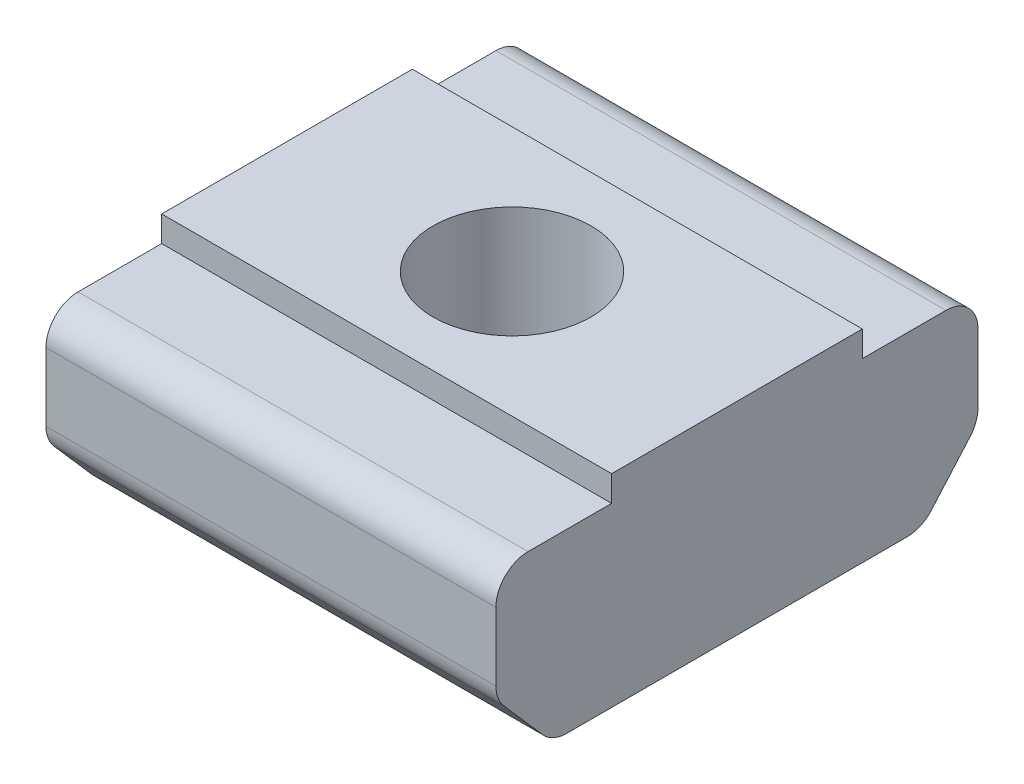
ISO-10303-21;
HEADER;
FILE_DESCRIPTION(('STEP AP214'),'2;1');
FILE_NAME('part.step','',(''),(''),'','','');
FILE_SCHEMA(('AUTOMOTIVE_DESIGN { 1 0 10303 214 1 1 1 1 }'));
ENDSEC;
DATA;
#1=APPLICATION_CONTEXT('core data for automotive mechanical design processes');
#2=APPLICATION_PROTOCOL_DEFINITION('international standard','automotive_design',2000,#1);
#3=PRODUCT_CONTEXT('',#1,'mechanical');
#4=PRODUCT('Part','Part','',(#3));
#5=PRODUCT_RELATED_PRODUCT_CATEGORY('part','',(#4));
#6=PRODUCT_DEFINITION_FORMATION('','',#4);
#7=PRODUCT_DEFINITION_CONTEXT('part definition',#1,'design');
#8=PRODUCT_DEFINITION('design','',#6,#7);
#9=PRODUCT_DEFINITION_SHAPE('','',#8);
#10=(LENGTH_UNIT() NAMED_UNIT(*) SI_UNIT(.MILLI.,.METRE.));
#11=(NAMED_UNIT(*) PLANE_ANGLE_UNIT() SI_UNIT($,.RADIAN.));
#12=(NAMED_UNIT(*) SI_UNIT($,.STERADIAN.) SOLID_ANGLE_UNIT());
#13=UNCERTAINTY_MEASURE_WITH_UNIT(LENGTH_MEASURE(1.E-05),#10,'distance_accuracy_value','');
#14=(GEOMETRIC_REPRESENTATION_CONTEXT(3) GLOBAL_UNCERTAINTY_ASSIGNED_CONTEXT((#13)) GLOBAL_UNIT_ASSIGNED_CONTEXT((#10,
#11,#12)) REPRESENTATION_CONTEXT('',''));
#15=CARTESIAN_POINT('',(0.,0.,0.));
#16=DIRECTION('',(0.,0.,1.));
#17=DIRECTION('',(1.,0.,0.));
#18=AXIS2_PLACEMENT_3D('',#15,#16,#17);
#19=CARTESIAN_POINT('',(7.,-0.800000000000002,3.9));
#20=DIRECTION('',(0.,0.,-1.));
#21=DIRECTION('',(-1.,0.,0.));
#22=AXIS2_PLACEMENT_3D('',#19,#20,#21);
#23=PLANE('',#22);
#24=DIRECTION('',(0.,-1.,0.));
#25=VECTOR('',#24,1.);
#26=CARTESIAN_POINT('',(-7.,-0.800000000000002,3.9));
#27=LINE('',#26,#25);
#28=CARTESIAN_POINT('',(-7.,0.,3.9));
#29=VERTEX_POINT('',#28);
#30=CARTESIAN_POINT('',(-7.,-0.800000000000002,3.9));
#31=VERTEX_POINT('',#30);
#32=EDGE_CURVE('E174',#29,#31,#27,.T.);
#33=ORIENTED_EDGE('',*,*,#32,.T.);
#34=DIRECTION('',(-1.,0.,0.));
#35=VECTOR('',#34,1.);
#36=CARTESIAN_POINT('',(7.,-0.800000000000002,3.9));
#37=LINE('',#36,#35);
#38=CARTESIAN_POINT('',(7.,-0.800000000000002,3.9));
#39=VERTEX_POINT('',#38);
#40=EDGE_CURVE('E156',#39,#31,#37,.T.);
#41=ORIENTED_EDGE('',*,*,#40,.F.);
#42=DIRECTION('',(0.,-1.,0.));
#43=VECTOR('',#42,1.);
#44=CARTESIAN_POINT('',(7.,-0.800000000000002,3.9));
#45=LINE('',#44,#43);
#46=CARTESIAN_POINT('',(7.,0.,3.9));
#47=VERTEX_POINT('',#46);
#48=EDGE_CURVE('E162',#47,#39,#45,.T.);
#49=ORIENTED_EDGE('',*,*,#48,.F.);
#50=DIRECTION('',(-1.,0.,0.));
#51=VECTOR('',#50,1.);
#52=CARTESIAN_POINT('',(7.,0.,3.9));
#53=LINE('',#52,#51);
#54=EDGE_CURVE('E251',#47,#29,#53,.T.);
#55=ORIENTED_EDGE('',*,*,#54,.T.);
#56=EDGE_LOOP('',(#33,#41,#49,#55));
#57=FACE_BOUND('',#56,.T.);
#58=ADVANCED_FACE('F36',(#57),#23,.F.);
#59=CARTESIAN_POINT('',(7.,-0.800000000000002,7.5));
#60=DIRECTION('',(0.,-1.,0.));
#61=DIRECTION('',(0.,0.,-1.));
#62=AXIS2_PLACEMENT_3D('',#59,#60,#61);
#63=PLANE('',#62);
#64=DIRECTION('',(0.,0.,1.));
#65=VECTOR('',#64,1.);
#66=CARTESIAN_POINT('',(-7.,-0.800000000000002,7.5));
#67=LINE('',#66,#65);
#68=CARTESIAN_POINT('',(-7.,-0.800000000000002,6.5));
#69=VERTEX_POINT('',#68);
#70=EDGE_CURVE('E260',#31,#69,#67,.T.);
#71=ORIENTED_EDGE('',*,*,#70,.T.);
#72=DIRECTION('',(-1.,0.,0.));
#73=VECTOR('',#72,1.);
#74=CARTESIAN_POINT('',(7.,-0.800000000000002,6.5));
#75=LINE('',#74,#73);
#76=CARTESIAN_POINT('',(7.,-0.800000000000002,6.5));
#77=VERTEX_POINT('',#76);
#78=EDGE_CURVE('E159',#69,#77,#75,.F.);
#79=ORIENTED_EDGE('',*,*,#78,.T.);
#80=DIRECTION('',(0.,0.,1.));
#81=VECTOR('',#80,1.);
#82=CARTESIAN_POINT('',(7.,-0.800000000000002,7.5));
#83=LINE('',#82,#81);
#84=EDGE_CURVE('E151',#39,#77,#83,.T.);
#85=ORIENTED_EDGE('',*,*,#84,.F.);
#86=ORIENTED_EDGE('',*,*,#40,.T.);
#87=EDGE_LOOP('',(#71,#79,#85,#86));
#88=FACE_BOUND('',#87,.T.);
#89=ADVANCED_FACE('F154',(#88),#63,.F.);
#90=CARTESIAN_POINT('',(7.,-0.800000000000002,7.5));
#91=DIRECTION('',(0.,0.,-1.));
#92=DIRECTION('',(0.,1.,0.));
#93=AXIS2_PLACEMENT_3D('',#90,#91,#92);
#94=PLANE('',#93);
#95=DIRECTION('',(0.,-1.,0.));
#96=VECTOR('',#95,1.);
#97=CARTESIAN_POINT('',(7.,-0.800000000000002,7.5));
#98=LINE('',#97,#96);
#99=CARTESIAN_POINT('',(7.,-1.8,7.5));
#100=VERTEX_POINT('',#99);
#101=CARTESIAN_POINT('',(7.,-3.92426488389505,7.5));
#102=VERTEX_POINT('',#101);
#103=EDGE_CURVE('E161',#100,#102,#98,.T.);
#104=ORIENTED_EDGE('',*,*,#103,.F.);
#105=DIRECTION('',(-1.,0.,0.));
#106=VECTOR('',#105,1.);
#107=CARTESIAN_POINT('',(7.,-1.8,7.5));
#108=LINE('',#107,#106);
#109=CARTESIAN_POINT('',(-7.,-1.8,7.5));
#110=VERTEX_POINT('',#109);
#111=EDGE_CURVE('E178',#100,#110,#108,.T.);
#112=ORIENTED_EDGE('',*,*,#111,.T.);
#113=DIRECTION('',(0.,-1.,0.));
#114=VECTOR('',#113,1.);
#115=CARTESIAN_POINT('',(-7.,-0.800000000000002,7.5));
#116=LINE('',#115,#114);
#117=CARTESIAN_POINT('',(-7.,-3.92426488389505,7.5));
#118=VERTEX_POINT('',#117);
#119=EDGE_CURVE('E263',#110,#118,#116,.T.);
#120=ORIENTED_EDGE('',*,*,#119,.T.);
#121=DIRECTION('',(-1.,0.,0.));
#122=VECTOR('',#121,1.);
#123=CARTESIAN_POINT('',(7.,-3.92426488389505,7.5));
#124=LINE('',#123,#122);
#125=EDGE_CURVE('E175',#118,#102,#124,.F.);
#126=ORIENTED_EDGE('',*,*,#125,.T.);
#127=EDGE_LOOP('',(#104,#112,#120,#126));
#128=FACE_BOUND('',#127,.T.);
#129=ADVANCED_FACE('F322',(#128),#94,.F.);
#130=CARTESIAN_POINT('',(7.,-4.3,7.5));
#131=DIRECTION('',(0.,0.658504607868518,-0.752576694706878));
#132=DIRECTION('',(0.,0.752576694706878,0.658504607868518));
#133=AXIS2_PLACEMENT_3D('',#130,#131,#132);
#134=PLANE('',#133);
#135=DIRECTION('',(0.,-0.752576694706877,-0.658504607868518));
#136=VECTOR('',#135,1.);
#137=CARTESIAN_POINT('',(7.,-4.3,7.5));
#138=LINE('',#137,#136);
#139=CARTESIAN_POINT('',(7.,-4.58276949176357,7.25257669470688));
#140=VERTEX_POINT('',#139);
#141=CARTESIAN_POINT('',(7.,-5.95850460786852,6.04880846811505));
#142=VERTEX_POINT('',#141);
#143=EDGE_CURVE('E297',#140,#142,#138,.T.);
#144=ORIENTED_EDGE('',*,*,#143,.F.);
#145=DIRECTION('',(-1.,0.,0.));
#146=VECTOR('',#145,1.);
#147=CARTESIAN_POINT('',(7.,-4.58276949176357,7.25257669470688));
#148=LINE('',#147,#146);
#149=CARTESIAN_POINT('',(-7.,-4.58276949176357,7.25257669470688));
#150=VERTEX_POINT('',#149);
#151=EDGE_CURVE('E213',#140,#150,#148,.T.);
#152=ORIENTED_EDGE('',*,*,#151,.T.);
#153=DIRECTION('',(0.,-0.752576694706877,-0.658504607868518));
#154=VECTOR('',#153,1.);
#155=CARTESIAN_POINT('',(-7.,-4.3,7.5));
#156=LINE('',#155,#154);
#157=CARTESIAN_POINT('',(-7.,-5.95850460786852,6.04880846811505));
#158=VERTEX_POINT('',#157);
#159=EDGE_CURVE('E273',#150,#158,#156,.T.);
#160=ORIENTED_EDGE('',*,*,#159,.T.);
#161=DIRECTION('',(-1.,0.,0.));
#162=VECTOR('',#161,1.);
#163=CARTESIAN_POINT('',(7.,-5.95850460786852,6.04880846811505));
#164=LINE('',#163,#162);
#165=EDGE_CURVE('E211',#158,#142,#164,.F.);
#166=ORIENTED_EDGE('',*,*,#165,.T.);
#167=EDGE_LOOP('',(#144,#152,#160,#166));
#168=FACE_BOUND('',#167,.T.);
#169=ADVANCED_FACE('F361',(#168),#134,.F.);
#170=CARTESIAN_POINT('',(7.,-6.3,-5.75));
#171=DIRECTION('',(0.,1.,0.));
#172=DIRECTION('',(0.,0.,1.));
#173=AXIS2_PLACEMENT_3D('',#170,#171,#172);
#174=PLANE('',#173);
#175=CARTESIAN_POINT('',(0.,-6.3,0.));
#176=DIRECTION('',(0.,1.,0.));
#177=DIRECTION('',(0.,0.,1.));
#178=AXIS2_PLACEMENT_3D('',#175,#176,#177);
#179=CIRCLE('',#178,2.4585);
#180=CARTESIAN_POINT('',(0.,-6.3,2.4585));
#181=VERTEX_POINT('',#180);
#182=EDGE_CURVE('E261',#181,#181,#179,.T.);
#183=ORIENTED_EDGE('',*,*,#182,.T.);
#184=EDGE_LOOP('',(#183));
#185=FACE_BOUND('',#184,.T.);
#186=DIRECTION('',(0.,0.,-1.));
#187=VECTOR('',#186,1.);
#188=CARTESIAN_POINT('',(7.,-6.3,-5.75));
#189=LINE('',#188,#187);
#190=CARTESIAN_POINT('',(7.,-6.3,5.29623177340817));
#191=VERTEX_POINT('',#190);
#192=CARTESIAN_POINT('',(7.,-6.3,-5.29623177340817));
#193=VERTEX_POINT('',#192);
#194=EDGE_CURVE('E290',#191,#193,#189,.T.);
#195=ORIENTED_EDGE('',*,*,#194,.F.);
#196=DIRECTION('',(-1.,0.,0.));
#197=VECTOR('',#196,1.);
#198=CARTESIAN_POINT('',(7.,-6.3,5.29623177340817));
#199=LINE('',#198,#197);
#200=CARTESIAN_POINT('',(-7.,-6.3,5.29623177340817));
#201=VERTEX_POINT('',#200);
#202=EDGE_CURVE('E218',#191,#201,#199,.T.);
#203=ORIENTED_EDGE('',*,*,#202,.T.);
#204=DIRECTION('',(0.,0.,-1.));
#205=VECTOR('',#204,1.);
#206=CARTESIAN_POINT('',(-7.,-6.3,-5.75));
#207=LINE('',#206,#205);
#208=CARTESIAN_POINT('',(-7.,-6.3,-5.29623177340817));
#209=VERTEX_POINT('',#208);
#210=EDGE_CURVE('E245',#201,#209,#207,.T.);
#211=ORIENTED_EDGE('',*,*,#210,.T.);
#212=DIRECTION('',(-1.,0.,0.));
#213=VECTOR('',#212,1.);
#214=CARTESIAN_POINT('',(7.,-6.3,-5.29623177340817));
#215=LINE('',#214,#213);
#216=EDGE_CURVE('E216',#209,#193,#215,.F.);
#217=ORIENTED_EDGE('',*,*,#216,.T.);
#218=EDGE_LOOP('',(#195,#203,#211,#217));
#219=FACE_BOUND('',#218,.T.);
#220=ADVANCED_FACE('F280',(#185,#219),#174,.F.);
#221=CARTESIAN_POINT('',(7.,-4.3,-7.5));
#222=DIRECTION('',(0.,0.658504607868518,0.752576694706878));
#223=DIRECTION('',(0.,-0.752576694706878,0.658504607868518));
#224=AXIS2_PLACEMENT_3D('',#221,#222,#223);
#225=PLANE('',#224);
#226=DIRECTION('',(0.,0.752576694706877,-0.658504607868518));
#227=VECTOR('',#226,1.);
#228=CARTESIAN_POINT('',(7.,-4.3,-7.5));
#229=LINE('',#228,#227);
#230=CARTESIAN_POINT('',(7.,-5.95850460786852,-6.04880846811505));
#231=VERTEX_POINT('',#230);
#232=CARTESIAN_POINT('',(7.,-4.58276949176357,-7.25257669470688));
#233=VERTEX_POINT('',#232);
#234=EDGE_CURVE('E289',#231,#233,#229,.T.);
#235=ORIENTED_EDGE('',*,*,#234,.F.);
#236=DIRECTION('',(-1.,0.,0.));
#237=VECTOR('',#236,1.);
#238=CARTESIAN_POINT('',(7.,-5.95850460786852,-6.04880846811505));
#239=LINE('',#238,#237);
#240=CARTESIAN_POINT('',(-7.,-5.95850460786852,-6.04880846811505));
#241=VERTEX_POINT('',#240);
#242=EDGE_CURVE('E223',#231,#241,#239,.T.);
#243=ORIENTED_EDGE('',*,*,#242,.T.);
#244=DIRECTION('',(0.,0.752576694706877,-0.658504607868518));
#245=VECTOR('',#244,1.);
#246=CARTESIAN_POINT('',(-7.,-4.3,-7.5));
#247=LINE('',#246,#245);
#248=CARTESIAN_POINT('',(-7.,-4.58276949176357,-7.25257669470688));
#249=VERTEX_POINT('',#248);
#250=EDGE_CURVE('E241',#241,#249,#247,.T.);
#251=ORIENTED_EDGE('',*,*,#250,.T.);
#252=DIRECTION('',(-1.,0.,0.));
#253=VECTOR('',#252,1.);
#254=CARTESIAN_POINT('',(7.,-4.58276949176357,-7.25257669470688));
#255=LINE('',#254,#253);
#256=EDGE_CURVE('E221',#249,#233,#255,.F.);
#257=ORIENTED_EDGE('',*,*,#256,.T.);
#258=EDGE_LOOP('',(#235,#243,#251,#257));
#259=FACE_BOUND('',#258,.T.);
#260=ADVANCED_FACE('F292',(#259),#225,.F.);
#261=CARTESIAN_POINT('',(7.,-0.8,-7.5));
#262=DIRECTION('',(0.,0.,1.));
#263=DIRECTION('',(0.,-1.,0.));
#264=AXIS2_PLACEMENT_3D('',#261,#262,#263);
#265=PLANE('',#264);
#266=DIRECTION('',(0.,1.,0.));
#267=VECTOR('',#266,1.);
#268=CARTESIAN_POINT('',(7.,-0.8,-7.5));
#269=LINE('',#268,#267);
#270=CARTESIAN_POINT('',(7.,-3.92426488389505,-7.5));
#271=VERTEX_POINT('',#270);
#272=CARTESIAN_POINT('',(7.,-1.8,-7.5));
#273=VERTEX_POINT('',#272);
#274=EDGE_CURVE('E231',#271,#273,#269,.T.);
#275=ORIENTED_EDGE('',*,*,#274,.F.);
#276=DIRECTION('',(-1.,0.,0.));
#277=VECTOR('',#276,1.);
#278=CARTESIAN_POINT('',(7.,-3.92426488389505,-7.5));
#279=LINE('',#278,#277);
#280=CARTESIAN_POINT('',(-7.,-3.92426488389505,-7.5));
#281=VERTEX_POINT('',#280);
#282=EDGE_CURVE('E44',#271,#281,#279,.T.);
#283=ORIENTED_EDGE('',*,*,#282,.T.);
#284=DIRECTION('',(0.,1.,0.));
#285=VECTOR('',#284,1.);
#286=CARTESIAN_POINT('',(-7.,-0.8,-7.5));
#287=LINE('',#286,#285);
#288=CARTESIAN_POINT('',(-7.,-1.8,-7.5));
#289=VERTEX_POINT('',#288);
#290=EDGE_CURVE('E230',#281,#289,#287,.T.);
#291=ORIENTED_EDGE('',*,*,#290,.T.);
#292=DIRECTION('',(-1.,0.,0.));
#293=VECTOR('',#292,1.);
#294=CARTESIAN_POINT('',(7.,-1.8,-7.5));
#295=LINE('',#294,#293);
#296=EDGE_CURVE('E59',#289,#273,#295,.F.);
#297=ORIENTED_EDGE('',*,*,#296,.T.);
#298=EDGE_LOOP('',(#275,#283,#291,#297));
#299=FACE_BOUND('',#298,.T.);
#300=ADVANCED_FACE('F229',(#299),#265,.F.);
#301=CARTESIAN_POINT('',(7.,-0.800000000000001,-3.9));
#302=DIRECTION('',(0.,-1.,0.));
#303=DIRECTION('',(0.,0.,-1.));
#304=AXIS2_PLACEMENT_3D('',#301,#302,#303);
#305=PLANE('',#304);
#306=DIRECTION('',(0.,0.,1.));
#307=VECTOR('',#306,1.);
#308=CARTESIAN_POINT('',(7.,-0.800000000000001,-3.9));
#309=LINE('',#308,#307);
#310=CARTESIAN_POINT('',(7.,-0.8,-6.5));
#311=VERTEX_POINT('',#310);
#312=CARTESIAN_POINT('',(7.,-0.800000000000001,-3.9));
#313=VERTEX_POINT('',#312);
#314=EDGE_CURVE('E295',#311,#313,#309,.T.);
#315=ORIENTED_EDGE('',*,*,#314,.F.);
#316=DIRECTION('',(-1.,0.,0.));
#317=VECTOR('',#316,1.);
#318=CARTESIAN_POINT('',(7.,-0.8,-6.5));
#319=LINE('',#318,#317);
#320=CARTESIAN_POINT('',(-7.,-0.8,-6.5));
#321=VERTEX_POINT('',#320);
#322=EDGE_CURVE('E11',#311,#321,#319,.T.);
#323=ORIENTED_EDGE('',*,*,#322,.T.);
#324=DIRECTION('',(0.,0.,1.));
#325=VECTOR('',#324,1.);
#326=CARTESIAN_POINT('',(-7.,-0.800000000000001,-3.9));
#327=LINE('',#326,#325);
#328=CARTESIAN_POINT('',(-7.,-0.800000000000001,-3.9));
#329=VERTEX_POINT('',#328);
#330=EDGE_CURVE('E240',#321,#329,#327,.T.);
#331=ORIENTED_EDGE('',*,*,#330,.T.);
#332=DIRECTION('',(-1.,0.,0.));
#333=VECTOR('',#332,1.);
#334=CARTESIAN_POINT('',(7.,-0.800000000000001,-3.9));
#335=LINE('',#334,#333);
#336=EDGE_CURVE('E176',#313,#329,#335,.T.);
#337=ORIENTED_EDGE('',*,*,#336,.F.);
#338=EDGE_LOOP('',(#315,#323,#331,#337));
#339=FACE_BOUND('',#338,.T.);
#340=ADVANCED_FACE('F305',(#339),#305,.F.);
#341=CARTESIAN_POINT('',(7.,0.,-3.9));
#342=DIRECTION('',(0.,0.,1.));
#343=DIRECTION('',(1.,0.,0.));
#344=AXIS2_PLACEMENT_3D('',#341,#342,#343);
#345=PLANE('',#344);
#346=DIRECTION('',(0.,1.,0.));
#347=VECTOR('',#346,1.);
#348=CARTESIAN_POINT('',(-7.,0.,-3.9));
#349=LINE('',#348,#347);
#350=CARTESIAN_POINT('',(-7.,0.,-3.9));
#351=VERTEX_POINT('',#350);
#352=EDGE_CURVE('E243',#329,#351,#349,.T.);
#353=ORIENTED_EDGE('',*,*,#352,.T.);
#354=DIRECTION('',(-1.,0.,0.));
#355=VECTOR('',#354,1.);
#356=CARTESIAN_POINT('',(7.,0.,-3.9));
#357=LINE('',#356,#355);
#358=CARTESIAN_POINT('',(7.,0.,-3.9));
#359=VERTEX_POINT('',#358);
#360=EDGE_CURVE('E181',#359,#351,#357,.T.);
#361=ORIENTED_EDGE('',*,*,#360,.F.);
#362=DIRECTION('',(0.,1.,0.));
#363=VECTOR('',#362,1.);
#364=CARTESIAN_POINT('',(7.,0.,-3.9));
#365=LINE('',#364,#363);
#366=EDGE_CURVE('E301',#313,#359,#365,.T.);
#367=ORIENTED_EDGE('',*,*,#366,.F.);
#368=ORIENTED_EDGE('',*,*,#336,.T.);
#369=EDGE_LOOP('',(#353,#361,#367,#368));
#370=FACE_BOUND('',#369,.T.);
#371=ADVANCED_FACE('F303',(#370),#345,.F.);
#372=CARTESIAN_POINT('',(7.,0.,3.9));
#373=DIRECTION('',(0.,-1.,0.));
#374=DIRECTION('',(0.,0.,-1.));
#375=AXIS2_PLACEMENT_3D('',#372,#373,#374);
#376=PLANE('',#375);
#377=CARTESIAN_POINT('',(0.,0.,0.));
#378=DIRECTION('',(0.,1.,0.));
#379=DIRECTION('',(0.,0.,1.));
#380=AXIS2_PLACEMENT_3D('',#377,#378,#379);
#381=CIRCLE('',#380,2.4585);
#382=CARTESIAN_POINT('',(0.,0.,2.4585));
#383=VERTEX_POINT('',#382);
#384=EDGE_CURVE('E266',#383,#383,#381,.T.);
#385=ORIENTED_EDGE('',*,*,#384,.F.);
#386=EDGE_LOOP('',(#385));
#387=FACE_BOUND('',#386,.T.);
#388=DIRECTION('',(0.,0.,1.));
#389=VECTOR('',#388,1.);
#390=CARTESIAN_POINT('',(-7.,0.,3.9));
#391=LINE('',#390,#389);
#392=EDGE_CURVE('E171',#351,#29,#391,.T.);
#393=ORIENTED_EDGE('',*,*,#392,.T.);
#394=ORIENTED_EDGE('',*,*,#54,.F.);
#395=DIRECTION('',(0.,0.,1.));
#396=VECTOR('',#395,1.);
#397=CARTESIAN_POINT('',(7.,0.,3.9));
#398=LINE('',#397,#396);
#399=EDGE_CURVE('E167',#359,#47,#398,.T.);
#400=ORIENTED_EDGE('',*,*,#399,.F.);
#401=ORIENTED_EDGE('',*,*,#360,.T.);
#402=EDGE_LOOP('',(#393,#394,#400,#401));
#403=FACE_BOUND('',#402,.T.);
#404=ADVANCED_FACE('F256',(#387,#403),#376,.F.);
#405=CARTESIAN_POINT('',(7.,0.,0.));
#406=DIRECTION('',(-1.,0.,0.));
#407=DIRECTION('',(0.,0.,1.));
#408=AXIS2_PLACEMENT_3D('',#405,#406,#407);
#409=PLANE('',#408);
#410=ORIENTED_EDGE('',*,*,#84,.T.);
#411=CARTESIAN_POINT('',(7.,-1.8,6.5));
#412=DIRECTION('',(-1.,0.,0.));
#413=DIRECTION('',(0.,0.,1.));
#414=AXIS2_PLACEMENT_3D('',#411,#412,#413);
#415=CIRCLE('',#414,1.);
#416=EDGE_CURVE('E209',#77,#100,#415,.F.);
#417=ORIENTED_EDGE('',*,*,#416,.T.);
#418=ORIENTED_EDGE('',*,*,#103,.T.);
#419=CARTESIAN_POINT('',(7.,-3.92426488389505,6.5));
#420=DIRECTION('',(-1.,0.,0.));
#421=DIRECTION('',(0.,0.,1.));
#422=AXIS2_PLACEMENT_3D('',#419,#420,#421);
#423=CIRCLE('',#422,1.);
#424=EDGE_CURVE('E207',#102,#140,#423,.F.);
#425=ORIENTED_EDGE('',*,*,#424,.T.);
#426=ORIENTED_EDGE('',*,*,#143,.T.);
#427=CARTESIAN_POINT('',(7.,-5.3,5.29623177340817));
#428=DIRECTION('',(-1.,0.,0.));
#429=DIRECTION('',(0.,0.,1.));
#430=AXIS2_PLACEMENT_3D('',#427,#428,#429);
#431=CIRCLE('',#430,1.);
#432=EDGE_CURVE('E205',#142,#191,#431,.F.);
#433=ORIENTED_EDGE('',*,*,#432,.T.);
#434=ORIENTED_EDGE('',*,*,#194,.T.);
#435=CARTESIAN_POINT('',(7.,-5.3,-5.29623177340817));
#436=DIRECTION('',(-1.,0.,0.));
#437=DIRECTION('',(0.,0.,1.));
#438=AXIS2_PLACEMENT_3D('',#435,#436,#437);
#439=CIRCLE('',#438,1.);
#440=EDGE_CURVE('E203',#193,#231,#439,.F.);
#441=ORIENTED_EDGE('',*,*,#440,.T.);
#442=ORIENTED_EDGE('',*,*,#234,.T.);
#443=CARTESIAN_POINT('',(7.,-3.92426488389505,-6.5));
#444=DIRECTION('',(-1.,0.,0.));
#445=DIRECTION('',(0.,0.,1.));
#446=AXIS2_PLACEMENT_3D('',#443,#444,#445);
#447=CIRCLE('',#446,1.);
#448=EDGE_CURVE('E201',#233,#271,#447,.F.);
#449=ORIENTED_EDGE('',*,*,#448,.T.);
#450=ORIENTED_EDGE('',*,*,#274,.T.);
#451=CARTESIAN_POINT('',(7.,-1.8,-6.5));
#452=DIRECTION('',(-1.,0.,0.));
#453=DIRECTION('',(0.,0.,1.));
#454=AXIS2_PLACEMENT_3D('',#451,#452,#453);
#455=CIRCLE('',#454,1.);
#456=EDGE_CURVE('E51',#273,#311,#455,.F.);
#457=ORIENTED_EDGE('',*,*,#456,.T.);
#458=ORIENTED_EDGE('',*,*,#314,.T.);
#459=ORIENTED_EDGE('',*,*,#366,.T.);
#460=ORIENTED_EDGE('',*,*,#399,.T.);
#461=ORIENTED_EDGE('',*,*,#48,.T.);
#462=EDGE_LOOP('',(#410,#417,#418,#425,#426,#433,#434,#441,#442,#449,#450,#457,#458,#459,#460,#461));
#463=FACE_BOUND('',#462,.T.);
#464=ADVANCED_FACE('F165',(#463),#409,.F.);
#465=CARTESIAN_POINT('',(-7.,0.,0.));
#466=DIRECTION('',(-1.,0.,0.));
#467=DIRECTION('',(0.,0.,1.));
#468=AXIS2_PLACEMENT_3D('',#465,#466,#467);
#469=PLANE('',#468);
#470=ORIENTED_EDGE('',*,*,#119,.F.);
#471=CARTESIAN_POINT('',(-7.,-1.8,6.5));
#472=DIRECTION('',(-1.,0.,0.));
#473=DIRECTION('',(0.,0.,1.));
#474=AXIS2_PLACEMENT_3D('',#471,#472,#473);
#475=CIRCLE('',#474,1.);
#476=EDGE_CURVE('E197',#110,#69,#475,.T.);
#477=ORIENTED_EDGE('',*,*,#476,.T.);
#478=ORIENTED_EDGE('',*,*,#70,.F.);
#479=ORIENTED_EDGE('',*,*,#32,.F.);
#480=ORIENTED_EDGE('',*,*,#392,.F.);
#481=ORIENTED_EDGE('',*,*,#352,.F.);
#482=ORIENTED_EDGE('',*,*,#330,.F.);
#483=CARTESIAN_POINT('',(-7.,-1.8,-6.5));
#484=DIRECTION('',(-1.,0.,0.));
#485=DIRECTION('',(0.,0.,1.));
#486=AXIS2_PLACEMENT_3D('',#483,#484,#485);
#487=CIRCLE('',#486,1.);
#488=EDGE_CURVE('E187',#321,#289,#487,.T.);
#489=ORIENTED_EDGE('',*,*,#488,.T.);
#490=ORIENTED_EDGE('',*,*,#290,.F.);
#491=CARTESIAN_POINT('',(-7.,-3.92426488389505,-6.5));
#492=DIRECTION('',(-1.,0.,0.));
#493=DIRECTION('',(0.,0.,1.));
#494=AXIS2_PLACEMENT_3D('',#491,#492,#493);
#495=CIRCLE('',#494,1.);
#496=EDGE_CURVE('E189',#281,#249,#495,.T.);
#497=ORIENTED_EDGE('',*,*,#496,.T.);
#498=ORIENTED_EDGE('',*,*,#250,.F.);
#499=CARTESIAN_POINT('',(-7.,-5.3,-5.29623177340817));
#500=DIRECTION('',(-1.,0.,0.));
#501=DIRECTION('',(0.,0.,1.));
#502=AXIS2_PLACEMENT_3D('',#499,#500,#501);
#503=CIRCLE('',#502,1.);
#504=EDGE_CURVE('E191',#241,#209,#503,.T.);
#505=ORIENTED_EDGE('',*,*,#504,.T.);
#506=ORIENTED_EDGE('',*,*,#210,.F.);
#507=CARTESIAN_POINT('',(-7.,-5.3,5.29623177340817));
#508=DIRECTION('',(-1.,0.,0.));
#509=DIRECTION('',(0.,0.,1.));
#510=AXIS2_PLACEMENT_3D('',#507,#508,#509);
#511=CIRCLE('',#510,1.);
#512=EDGE_CURVE('E193',#201,#158,#511,.T.);
#513=ORIENTED_EDGE('',*,*,#512,.T.);
#514=ORIENTED_EDGE('',*,*,#159,.F.);
#515=CARTESIAN_POINT('',(-7.,-3.92426488389505,6.5));
#516=DIRECTION('',(-1.,0.,0.));
#517=DIRECTION('',(0.,0.,1.));
#518=AXIS2_PLACEMENT_3D('',#515,#516,#517);
#519=CIRCLE('',#518,1.);
#520=EDGE_CURVE('E195',#150,#118,#519,.T.);
#521=ORIENTED_EDGE('',*,*,#520,.T.);
#522=EDGE_LOOP('',(#470,#477,#478,#479,#480,#481,#482,#489,#490,#497,#498,#505,#506,#513,#514,#521));
#523=FACE_BOUND('',#522,.T.);
#524=ADVANCED_FACE('F236',(#523),#469,.T.);
#525=CARTESIAN_POINT('',(7.,-1.8,6.5));
#526=DIRECTION('',(-1.,0.,0.));
#527=DIRECTION('',(0.,0.,1.));
#528=AXIS2_PLACEMENT_3D('',#525,#526,#527);
#529=CYLINDRICAL_SURFACE('',#528,1.);
#530=ORIENTED_EDGE('',*,*,#416,.F.);
#531=ORIENTED_EDGE('',*,*,#78,.F.);
#532=ORIENTED_EDGE('',*,*,#476,.F.);
#533=ORIENTED_EDGE('',*,*,#111,.F.);
#534=EDGE_LOOP('',(#530,#531,#532,#533));
#535=FACE_BOUND('',#534,.T.);
#536=ADVANCED_FACE('F326',(#535),#529,.T.);
#537=CARTESIAN_POINT('',(7.,-3.92426488389505,6.5));
#538=DIRECTION('',(-1.,0.,0.));
#539=DIRECTION('',(0.,0.,1.));
#540=AXIS2_PLACEMENT_3D('',#537,#538,#539);
#541=CYLINDRICAL_SURFACE('',#540,1.);
#542=ORIENTED_EDGE('',*,*,#424,.F.);
#543=ORIENTED_EDGE('',*,*,#125,.F.);
#544=ORIENTED_EDGE('',*,*,#520,.F.);
#545=ORIENTED_EDGE('',*,*,#151,.F.);
#546=EDGE_LOOP('',(#542,#543,#544,#545));
#547=FACE_BOUND('',#546,.T.);
#548=ADVANCED_FACE('F329',(#547),#541,.T.);
#549=CARTESIAN_POINT('',(7.,-5.3,5.29623177340817));
#550=DIRECTION('',(-1.,0.,0.));
#551=DIRECTION('',(0.,0.,1.));
#552=AXIS2_PLACEMENT_3D('',#549,#550,#551);
#553=CYLINDRICAL_SURFACE('',#552,1.);
#554=ORIENTED_EDGE('',*,*,#432,.F.);
#555=ORIENTED_EDGE('',*,*,#165,.F.);
#556=ORIENTED_EDGE('',*,*,#512,.F.);
#557=ORIENTED_EDGE('',*,*,#202,.F.);
#558=EDGE_LOOP('',(#554,#555,#556,#557));
#559=FACE_BOUND('',#558,.T.);
#560=ADVANCED_FACE('F333',(#559),#553,.T.);
#561=CARTESIAN_POINT('',(7.,-5.3,-5.29623177340817));
#562=DIRECTION('',(-1.,0.,0.));
#563=DIRECTION('',(0.,0.,1.));
#564=AXIS2_PLACEMENT_3D('',#561,#562,#563);
#565=CYLINDRICAL_SURFACE('',#564,1.);
#566=ORIENTED_EDGE('',*,*,#440,.F.);
#567=ORIENTED_EDGE('',*,*,#216,.F.);
#568=ORIENTED_EDGE('',*,*,#504,.F.);
#569=ORIENTED_EDGE('',*,*,#242,.F.);
#570=EDGE_LOOP('',(#566,#567,#568,#569));
#571=FACE_BOUND('',#570,.T.);
#572=ADVANCED_FACE('F285',(#571),#565,.T.);
#573=CARTESIAN_POINT('',(7.,-3.92426488389505,-6.5));
#574=DIRECTION('',(-1.,0.,0.));
#575=DIRECTION('',(0.,0.,1.));
#576=AXIS2_PLACEMENT_3D('',#573,#574,#575);
#577=CYLINDRICAL_SURFACE('',#576,1.);
#578=ORIENTED_EDGE('',*,*,#448,.F.);
#579=ORIENTED_EDGE('',*,*,#256,.F.);
#580=ORIENTED_EDGE('',*,*,#496,.F.);
#581=ORIENTED_EDGE('',*,*,#282,.F.);
#582=EDGE_LOOP('',(#578,#579,#580,#581));
#583=FACE_BOUND('',#582,.T.);
#584=ADVANCED_FACE('F310',(#583),#577,.T.);
#585=CARTESIAN_POINT('',(7.,-1.8,-6.5));
#586=DIRECTION('',(-1.,0.,0.));
#587=DIRECTION('',(0.,0.,1.));
#588=AXIS2_PLACEMENT_3D('',#585,#586,#587);
#589=CYLINDRICAL_SURFACE('',#588,1.);
#590=ORIENTED_EDGE('',*,*,#456,.F.);
#591=ORIENTED_EDGE('',*,*,#296,.F.);
#592=ORIENTED_EDGE('',*,*,#488,.F.);
#593=ORIENTED_EDGE('',*,*,#322,.F.);
#594=EDGE_LOOP('',(#590,#591,#592,#593));
#595=FACE_BOUND('',#594,.T.);
#596=ADVANCED_FACE('F38',(#595),#589,.T.);
#597=CARTESIAN_POINT('',(0.,0.,0.));
#598=DIRECTION('',(0.,1.,0.));
#599=DIRECTION('',(0.,0.,1.));
#600=AXIS2_PLACEMENT_3D('',#597,#598,#599);
#601=CYLINDRICAL_SURFACE('',#600,2.4585);
#602=ORIENTED_EDGE('',*,*,#182,.F.);
#603=EDGE_LOOP('',(#602));
#604=FACE_BOUND('',#603,.T.);
#605=ORIENTED_EDGE('',*,*,#384,.T.);
#606=EDGE_LOOP('',(#605));
#607=FACE_BOUND('',#606,.T.);
#608=ADVANCED_FACE('F309',(#604,#607),#601,.F.);
#609=CLOSED_SHELL('',(#58,#89,#129,#169,#220,#260,#300,#340,#371,#404,#464,#524,#536,#548,#560,
#572,#584,#596,#608));
#610=MANIFOLD_SOLID_BREP('B2',#609);
#611=ADVANCED_BREP_SHAPE_REPRESENTATION('',(#18,#610),#14);
#612=SHAPE_DEFINITION_REPRESENTATION(#9,#611);
ENDSEC;
END-ISO-10303-21;
